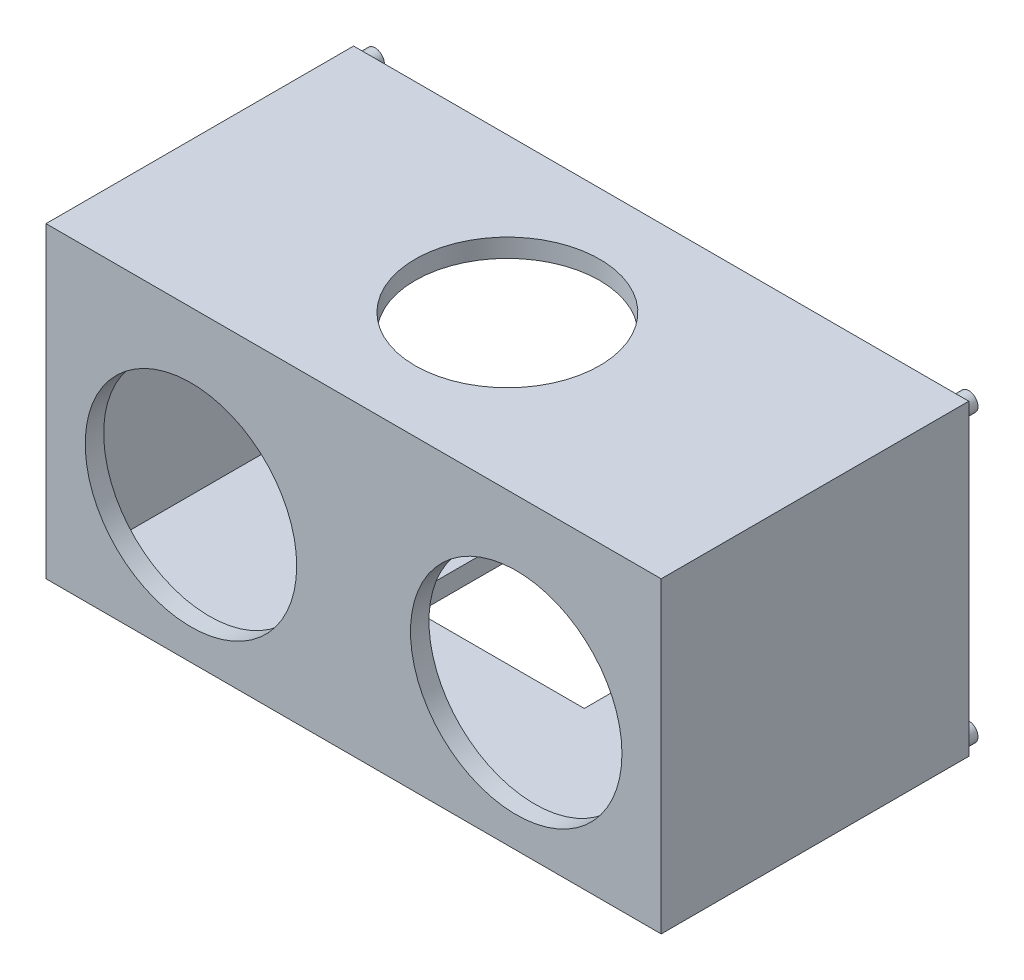
ISO-10303-21;
HEADER;
FILE_DESCRIPTION(('STEP AP214'),'2;1');
FILE_NAME('part.step','',(''),(''),'','','');
FILE_SCHEMA(('AUTOMOTIVE_DESIGN { 1 0 10303 214 1 1 1 1 }'));
ENDSEC;
DATA;
#1=APPLICATION_CONTEXT('core data for automotive mechanical design processes');
#2=APPLICATION_PROTOCOL_DEFINITION('international standard','automotive_design',2000,#1);
#3=PRODUCT_CONTEXT('',#1,'mechanical');
#4=PRODUCT('Part','Part','',(#3));
#5=PRODUCT_RELATED_PRODUCT_CATEGORY('part','',(#4));
#6=PRODUCT_DEFINITION_FORMATION('','',#4);
#7=PRODUCT_DEFINITION_CONTEXT('part definition',#1,'design');
#8=PRODUCT_DEFINITION('design','',#6,#7);
#9=PRODUCT_DEFINITION_SHAPE('','',#8);
#10=(LENGTH_UNIT() NAMED_UNIT(*) SI_UNIT(.MILLI.,.METRE.));
#11=(NAMED_UNIT(*) PLANE_ANGLE_UNIT() SI_UNIT($,.RADIAN.));
#12=(NAMED_UNIT(*) SI_UNIT($,.STERADIAN.) SOLID_ANGLE_UNIT());
#13=UNCERTAINTY_MEASURE_WITH_UNIT(LENGTH_MEASURE(1.E-05),#10,'distance_accuracy_value','');
#14=(GEOMETRIC_REPRESENTATION_CONTEXT(3) GLOBAL_UNCERTAINTY_ASSIGNED_CONTEXT((#13)) GLOBAL_UNIT_ASSIGNED_CONTEXT((#10,
#11,#12)) REPRESENTATION_CONTEXT('',''));
#15=CARTESIAN_POINT('',(0.,0.,0.));
#16=DIRECTION('',(0.,0.,1.));
#17=DIRECTION('',(1.,0.,0.));
#18=AXIS2_PLACEMENT_3D('',#15,#16,#17);
#19=CARTESIAN_POINT('',(-25.4,-12.7,25.4));
#20=DIRECTION('',(0.,1.,0.));
#21=DIRECTION('',(0.,0.,1.));
#22=AXIS2_PLACEMENT_3D('',#19,#20,#21);
#23=PLANE('',#22);
#24=DIRECTION('',(0.,0.,-1.));
#25=VECTOR('',#24,1.);
#26=CARTESIAN_POINT('',(7.62,-12.7,13.97));
#27=LINE('',#26,#25);
#28=CARTESIAN_POINT('',(7.62,-12.7,13.97));
#29=VERTEX_POINT('',#28);
#30=CARTESIAN_POINT('',(7.62,-12.7,0.));
#31=VERTEX_POINT('',#30);
#32=EDGE_CURVE('E156',#29,#31,#27,.T.);
#33=ORIENTED_EDGE('',*,*,#32,.T.);
#34=DIRECTION('',(1.,0.,0.));
#35=VECTOR('',#34,1.);
#36=CARTESIAN_POINT('',(-25.4,-12.7,0.));
#37=LINE('',#36,#35);
#38=CARTESIAN_POINT('',(25.4,-12.7,0.));
#39=VERTEX_POINT('',#38);
#40=EDGE_CURVE('E273',#31,#39,#37,.T.);
#41=ORIENTED_EDGE('',*,*,#40,.T.);
#42=DIRECTION('',(0.,0.,-1.));
#43=VECTOR('',#42,1.);
#44=CARTESIAN_POINT('',(25.4,-12.7,25.4));
#45=LINE('',#44,#43);
#46=CARTESIAN_POINT('',(25.4,-12.7,25.4));
#47=VERTEX_POINT('',#46);
#48=EDGE_CURVE('E289',#47,#39,#45,.T.);
#49=ORIENTED_EDGE('',*,*,#48,.F.);
#50=DIRECTION('',(1.,0.,0.));
#51=VECTOR('',#50,1.);
#52=CARTESIAN_POINT('',(-25.4,-12.7,25.4));
#53=LINE('',#52,#51);
#54=CARTESIAN_POINT('',(-25.4,-12.7,25.4));
#55=VERTEX_POINT('',#54);
#56=EDGE_CURVE('E259',#55,#47,#53,.T.);
#57=ORIENTED_EDGE('',*,*,#56,.F.);
#58=DIRECTION('',(0.,0.,-1.));
#59=VECTOR('',#58,1.);
#60=CARTESIAN_POINT('',(-25.4,-12.7,25.4));
#61=LINE('',#60,#59);
#62=CARTESIAN_POINT('',(-25.4,-12.7,0.));
#63=VERTEX_POINT('',#62);
#64=EDGE_CURVE('E293',#55,#63,#61,.T.);
#65=ORIENTED_EDGE('',*,*,#64,.T.);
#66=CARTESIAN_POINT('',(-7.62,-12.7,0.));
#67=VERTEX_POINT('',#66);
#68=EDGE_CURVE('E274',#63,#67,#37,.T.);
#69=ORIENTED_EDGE('',*,*,#68,.T.);
#70=DIRECTION('',(0.,0.,-1.));
#71=VECTOR('',#70,1.);
#72=CARTESIAN_POINT('',(-7.62,-12.7,13.97));
#73=LINE('',#72,#71);
#74=CARTESIAN_POINT('',(-7.62,-12.7,13.97));
#75=VERTEX_POINT('',#74);
#76=EDGE_CURVE('E162',#75,#67,#73,.T.);
#77=ORIENTED_EDGE('',*,*,#76,.F.);
#78=DIRECTION('',(1.,0.,0.));
#79=VECTOR('',#78,1.);
#80=CARTESIAN_POINT('',(-7.62,-12.7,13.97));
#81=LINE('',#80,#79);
#82=EDGE_CURVE('E149',#75,#29,#81,.T.);
#83=ORIENTED_EDGE('',*,*,#82,.T.);
#84=EDGE_LOOP('',(#33,#41,#49,#57,#65,#69,#77,#83));
#85=FACE_BOUND('',#84,.T.);
#86=ADVANCED_FACE('F45',(#85),#23,.F.);
#87=CARTESIAN_POINT('',(0.,0.,0.));
#88=DIRECTION('',(0.,0.,1.));
#89=DIRECTION('',(1.,0.,0.));
#90=AXIS2_PLACEMENT_3D('',#87,#88,#89);
#91=PLANE('',#90);
#92=CARTESIAN_POINT('',(24.511,11.811,0.));
#93=DIRECTION('',(0.,0.,1.));
#94=DIRECTION('',(1.,0.,0.));
#95=AXIS2_PLACEMENT_3D('',#92,#93,#94);
#96=CIRCLE('',#95,0.761999999999999);
#97=CARTESIAN_POINT('',(25.273,11.811,0.));
#98=VERTEX_POINT('',#97);
#99=EDGE_CURVE('E297',#98,#98,#96,.F.);
#100=ORIENTED_EDGE('',*,*,#99,.F.);
#101=EDGE_LOOP('',(#100));
#102=FACE_BOUND('',#101,.T.);
#103=CARTESIAN_POINT('',(-24.511,11.811,0.));
#104=DIRECTION('',(0.,0.,1.));
#105=DIRECTION('',(1.,0.,0.));
#106=AXIS2_PLACEMENT_3D('',#103,#104,#105);
#107=CIRCLE('',#106,0.761999999999999);
#108=CARTESIAN_POINT('',(-23.749,11.811,0.));
#109=VERTEX_POINT('',#108);
#110=EDGE_CURVE('E301',#109,#109,#107,.F.);
#111=ORIENTED_EDGE('',*,*,#110,.F.);
#112=EDGE_LOOP('',(#111));
#113=FACE_BOUND('',#112,.T.);
#114=CARTESIAN_POINT('',(-24.511,-11.811,0.));
#115=DIRECTION('',(0.,0.,1.));
#116=DIRECTION('',(1.,0.,0.));
#117=AXIS2_PLACEMENT_3D('',#114,#115,#116);
#118=CIRCLE('',#117,0.761999999999999);
#119=CARTESIAN_POINT('',(-23.749,-11.811,0.));
#120=VERTEX_POINT('',#119);
#121=EDGE_CURVE('E55',#120,#120,#118,.F.);
#122=ORIENTED_EDGE('',*,*,#121,.F.);
#123=EDGE_LOOP('',(#122));
#124=FACE_BOUND('',#123,.T.);
#125=CARTESIAN_POINT('',(24.511,-11.811,0.));
#126=DIRECTION('',(0.,0.,1.));
#127=DIRECTION('',(1.,0.,0.));
#128=AXIS2_PLACEMENT_3D('',#125,#126,#127);
#129=CIRCLE('',#128,0.761999999999999);
#130=CARTESIAN_POINT('',(25.273,-11.811,0.));
#131=VERTEX_POINT('',#130);
#132=EDGE_CURVE('E11',#131,#131,#129,.F.);
#133=ORIENTED_EDGE('',*,*,#132,.F.);
#134=EDGE_LOOP('',(#133));
#135=FACE_BOUND('',#134,.T.);
#136=DIRECTION('',(0.,-1.,0.));
#137=VECTOR('',#136,1.);
#138=CARTESIAN_POINT('',(7.62,31.8501021570466,0.));
#139=LINE('',#138,#137);
#140=CARTESIAN_POINT('',(7.62,-11.176,0.));
#141=VERTEX_POINT('',#140);
#142=EDGE_CURVE('E153',#141,#31,#139,.T.);
#143=ORIENTED_EDGE('',*,*,#142,.F.);
#144=DIRECTION('',(1.,0.,0.));
#145=VECTOR('',#144,1.);
#146=CARTESIAN_POINT('',(-25.4,-11.176,0.));
#147=LINE('',#146,#145);
#148=CARTESIAN_POINT('',(23.876,-11.176,0.));
#149=VERTEX_POINT('',#148);
#150=EDGE_CURVE('E244',#141,#149,#147,.T.);
#151=ORIENTED_EDGE('',*,*,#150,.T.);
#152=DIRECTION('',(0.,1.,0.));
#153=VECTOR('',#152,1.);
#154=CARTESIAN_POINT('',(23.876,12.7,0.));
#155=LINE('',#154,#153);
#156=CARTESIAN_POINT('',(23.876,11.176,0.));
#157=VERTEX_POINT('',#156);
#158=EDGE_CURVE('E247',#149,#157,#155,.T.);
#159=ORIENTED_EDGE('',*,*,#158,.T.);
#160=DIRECTION('',(-1.,0.,0.));
#161=VECTOR('',#160,1.);
#162=CARTESIAN_POINT('',(-25.4,11.176,0.));
#163=LINE('',#162,#161);
#164=CARTESIAN_POINT('',(-23.876,11.176,0.));
#165=VERTEX_POINT('',#164);
#166=EDGE_CURVE('E222',#157,#165,#163,.T.);
#167=ORIENTED_EDGE('',*,*,#166,.T.);
#168=DIRECTION('',(0.,-1.,0.));
#169=VECTOR('',#168,1.);
#170=CARTESIAN_POINT('',(-23.876,12.7,0.));
#171=LINE('',#170,#169);
#172=CARTESIAN_POINT('',(-23.876,-11.176,0.));
#173=VERTEX_POINT('',#172);
#174=EDGE_CURVE('E210',#165,#173,#171,.T.);
#175=ORIENTED_EDGE('',*,*,#174,.T.);
#176=CARTESIAN_POINT('',(-7.62,-11.176,0.));
#177=VERTEX_POINT('',#176);
#178=EDGE_CURVE('E251',#173,#177,#147,.T.);
#179=ORIENTED_EDGE('',*,*,#178,.T.);
#180=DIRECTION('',(0.,-1.,0.));
#181=VECTOR('',#180,1.);
#182=CARTESIAN_POINT('',(-7.62,31.8501021570466,0.));
#183=LINE('',#182,#181);
#184=EDGE_CURVE('E180',#177,#67,#183,.T.);
#185=ORIENTED_EDGE('',*,*,#184,.T.);
#186=ORIENTED_EDGE('',*,*,#68,.F.);
#187=DIRECTION('',(0.,-1.,0.));
#188=VECTOR('',#187,1.);
#189=CARTESIAN_POINT('',(-25.4,12.7,0.));
#190=LINE('',#189,#188);
#191=CARTESIAN_POINT('',(-25.4,12.7,0.));
#192=VERTEX_POINT('',#191);
#193=EDGE_CURVE('E215',#192,#63,#190,.T.);
#194=ORIENTED_EDGE('',*,*,#193,.F.);
#195=DIRECTION('',(-1.,0.,0.));
#196=VECTOR('',#195,1.);
#197=CARTESIAN_POINT('',(-25.4,12.7,0.));
#198=LINE('',#197,#196);
#199=CARTESIAN_POINT('',(25.4,12.7,0.));
#200=VERTEX_POINT('',#199);
#201=EDGE_CURVE('E260',#200,#192,#198,.T.);
#202=ORIENTED_EDGE('',*,*,#201,.F.);
#203=DIRECTION('',(0.,1.,0.));
#204=VECTOR('',#203,1.);
#205=CARTESIAN_POINT('',(25.4,12.7,0.));
#206=LINE('',#205,#204);
#207=EDGE_CURVE('E277',#39,#200,#206,.T.);
#208=ORIENTED_EDGE('',*,*,#207,.F.);
#209=ORIENTED_EDGE('',*,*,#40,.F.);
#210=EDGE_LOOP('',(#143,#151,#159,#167,#175,#179,#185,#186,#194,#202,#208,#209));
#211=FACE_BOUND('',#210,.T.);
#212=ADVANCED_FACE('F347',(#102,#113,#124,#135,#211),#91,.F.);
#213=CARTESIAN_POINT('',(-25.4,-11.176,25.4));
#214=DIRECTION('',(0.,1.,0.));
#215=DIRECTION('',(0.,0.,1.));
#216=AXIS2_PLACEMENT_3D('',#213,#214,#215);
#217=PLANE('',#216);
#218=DIRECTION('',(-1.,0.,0.));
#219=VECTOR('',#218,1.);
#220=CARTESIAN_POINT('',(-25.4,-11.176,13.97));
#221=LINE('',#220,#219);
#222=CARTESIAN_POINT('',(7.62,-11.176,13.97));
#223=VERTEX_POINT('',#222);
#224=CARTESIAN_POINT('',(-7.62,-11.176,13.97));
#225=VERTEX_POINT('',#224);
#226=EDGE_CURVE('E151',#223,#225,#221,.T.);
#227=ORIENTED_EDGE('',*,*,#226,.T.);
#228=DIRECTION('',(0.,0.,1.));
#229=VECTOR('',#228,1.);
#230=CARTESIAN_POINT('',(-7.62,-11.176,25.4));
#231=LINE('',#230,#229);
#232=CARTESIAN_POINT('',(-7.62,-11.176,12.7));
#233=VERTEX_POINT('',#232);
#234=EDGE_CURVE('E71',#233,#225,#231,.T.);
#235=ORIENTED_EDGE('',*,*,#234,.F.);
#236=EDGE_CURVE('E186',#177,#233,#231,.T.);
#237=ORIENTED_EDGE('',*,*,#236,.F.);
#238=ORIENTED_EDGE('',*,*,#178,.F.);
#239=DIRECTION('',(0.,0.,-1.));
#240=VECTOR('',#239,1.);
#241=CARTESIAN_POINT('',(-23.876,-11.176,25.4));
#242=LINE('',#241,#240);
#243=CARTESIAN_POINT('',(-23.876,-11.176,23.876));
#244=VERTEX_POINT('',#243);
#245=EDGE_CURVE('E211',#244,#173,#242,.T.);
#246=ORIENTED_EDGE('',*,*,#245,.F.);
#247=DIRECTION('',(1.,0.,0.));
#248=VECTOR('',#247,1.);
#249=CARTESIAN_POINT('',(-25.4,-11.176,23.876));
#250=LINE('',#249,#248);
#251=CARTESIAN_POINT('',(23.876,-11.176,23.876));
#252=VERTEX_POINT('',#251);
#253=EDGE_CURVE('E221',#244,#252,#250,.T.);
#254=ORIENTED_EDGE('',*,*,#253,.T.);
#255=DIRECTION('',(0.,0.,-1.));
#256=VECTOR('',#255,1.);
#257=CARTESIAN_POINT('',(23.876,-11.176,25.4));
#258=LINE('',#257,#256);
#259=EDGE_CURVE('E216',#252,#149,#258,.T.);
#260=ORIENTED_EDGE('',*,*,#259,.T.);
#261=ORIENTED_EDGE('',*,*,#150,.F.);
#262=DIRECTION('',(0.,0.,1.));
#263=VECTOR('',#262,1.);
#264=CARTESIAN_POINT('',(7.62,-11.176,25.4));
#265=LINE('',#264,#263);
#266=CARTESIAN_POINT('',(7.62,-11.176,12.7));
#267=VERTEX_POINT('',#266);
#268=EDGE_CURVE('E189',#141,#267,#265,.T.);
#269=ORIENTED_EDGE('',*,*,#268,.T.);
#270=EDGE_CURVE('E63',#267,#223,#265,.T.);
#271=ORIENTED_EDGE('',*,*,#270,.T.);
#272=EDGE_LOOP('',(#227,#235,#237,#238,#246,#254,#260,#261,#269,#271));
#273=FACE_BOUND('',#272,.T.);
#274=ADVANCED_FACE('F359',(#273),#217,.T.);
#275=CARTESIAN_POINT('',(-25.4,12.7,25.4));
#276=DIRECTION('',(1.,0.,0.));
#277=DIRECTION('',(0.,1.,0.));
#278=AXIS2_PLACEMENT_3D('',#275,#276,#277);
#279=PLANE('',#278);
#280=ORIENTED_EDGE('',*,*,#193,.T.);
#281=ORIENTED_EDGE('',*,*,#64,.F.);
#282=DIRECTION('',(0.,-1.,0.));
#283=VECTOR('',#282,1.);
#284=CARTESIAN_POINT('',(-25.4,12.7,25.4));
#285=LINE('',#284,#283);
#286=CARTESIAN_POINT('',(-25.4,12.7,25.4));
#287=VERTEX_POINT('',#286);
#288=EDGE_CURVE('E255',#287,#55,#285,.T.);
#289=ORIENTED_EDGE('',*,*,#288,.F.);
#290=DIRECTION('',(0.,0.,-1.));
#291=VECTOR('',#290,1.);
#292=CARTESIAN_POINT('',(-25.4,12.7,25.4));
#293=LINE('',#292,#291);
#294=EDGE_CURVE('E269',#287,#192,#293,.T.);
#295=ORIENTED_EDGE('',*,*,#294,.T.);
#296=EDGE_LOOP('',(#280,#281,#289,#295));
#297=FACE_BOUND('',#296,.T.);
#298=ADVANCED_FACE('F47',(#297),#279,.F.);
#299=CARTESIAN_POINT('',(25.4,12.7,25.4));
#300=DIRECTION('',(-1.,0.,0.));
#301=DIRECTION('',(0.,-1.,0.));
#302=AXIS2_PLACEMENT_3D('',#299,#300,#301);
#303=PLANE('',#302);
#304=ORIENTED_EDGE('',*,*,#207,.T.);
#305=DIRECTION('',(0.,0.,-1.));
#306=VECTOR('',#305,1.);
#307=CARTESIAN_POINT('',(25.4,12.7,25.4));
#308=LINE('',#307,#306);
#309=CARTESIAN_POINT('',(25.4,12.7,25.4));
#310=VERTEX_POINT('',#309);
#311=EDGE_CURVE('E285',#310,#200,#308,.T.);
#312=ORIENTED_EDGE('',*,*,#311,.F.);
#313=DIRECTION('',(0.,1.,0.));
#314=VECTOR('',#313,1.);
#315=CARTESIAN_POINT('',(25.4,12.7,25.4));
#316=LINE('',#315,#314);
#317=EDGE_CURVE('E263',#47,#310,#316,.T.);
#318=ORIENTED_EDGE('',*,*,#317,.F.);
#319=ORIENTED_EDGE('',*,*,#48,.T.);
#320=EDGE_LOOP('',(#304,#312,#318,#319));
#321=FACE_BOUND('',#320,.T.);
#322=ADVANCED_FACE('F335',(#321),#303,.F.);
#323=CARTESIAN_POINT('',(-25.4,12.7,25.4));
#324=DIRECTION('',(0.,-1.,0.));
#325=DIRECTION('',(0.,0.,-1.));
#326=AXIS2_PLACEMENT_3D('',#323,#324,#325);
#327=PLANE('',#326);
#328=CARTESIAN_POINT('',(0.,12.7,12.7));
#329=DIRECTION('',(0.,1.,0.));
#330=DIRECTION('',(0.,0.,1.));
#331=AXIS2_PLACEMENT_3D('',#328,#329,#330);
#332=CIRCLE('',#331,7.62);
#333=CARTESIAN_POINT('',(0.,12.7,20.32));
#334=VERTEX_POINT('',#333);
#335=EDGE_CURVE('E170',#334,#334,#332,.T.);
#336=ORIENTED_EDGE('',*,*,#335,.F.);
#337=EDGE_LOOP('',(#336));
#338=FACE_BOUND('',#337,.T.);
#339=ORIENTED_EDGE('',*,*,#201,.T.);
#340=ORIENTED_EDGE('',*,*,#294,.F.);
#341=DIRECTION('',(-1.,0.,0.));
#342=VECTOR('',#341,1.);
#343=CARTESIAN_POINT('',(-25.4,12.7,25.4));
#344=LINE('',#343,#342);
#345=EDGE_CURVE('E266',#310,#287,#344,.T.);
#346=ORIENTED_EDGE('',*,*,#345,.F.);
#347=ORIENTED_EDGE('',*,*,#311,.T.);
#348=EDGE_LOOP('',(#339,#340,#346,#347));
#349=FACE_BOUND('',#348,.T.);
#350=ADVANCED_FACE('F331',(#338,#349),#327,.F.);
#351=CARTESIAN_POINT('',(0.,0.,25.4));
#352=DIRECTION('',(0.,0.,1.));
#353=DIRECTION('',(1.,0.,0.));
#354=AXIS2_PLACEMENT_3D('',#351,#352,#353);
#355=PLANE('',#354);
#356=CARTESIAN_POINT('',(-13.43025,-1.42875,25.4));
#357=DIRECTION('',(0.,0.,1.));
#358=DIRECTION('',(1.,0.,0.));
#359=AXIS2_PLACEMENT_3D('',#356,#357,#358);
#360=CIRCLE('',#359,8.73125);
#361=CARTESIAN_POINT('',(-4.699,-1.42875,25.4));
#362=VERTEX_POINT('',#361);
#363=EDGE_CURVE('E320',#362,#362,#360,.T.);
#364=ORIENTED_EDGE('',*,*,#363,.F.);
#365=EDGE_LOOP('',(#364));
#366=FACE_BOUND('',#365,.T.);
#367=CARTESIAN_POINT('',(13.43025,-1.42875,25.4));
#368=DIRECTION('',(0.,0.,1.));
#369=DIRECTION('',(1.,0.,0.));
#370=AXIS2_PLACEMENT_3D('',#367,#368,#369);
#371=CIRCLE('',#370,8.73124999999999);
#372=CARTESIAN_POINT('',(22.1615,-1.42875,25.4));
#373=VERTEX_POINT('',#372);
#374=EDGE_CURVE('E310',#373,#373,#371,.T.);
#375=ORIENTED_EDGE('',*,*,#374,.F.);
#376=EDGE_LOOP('',(#375));
#377=FACE_BOUND('',#376,.T.);
#378=ORIENTED_EDGE('',*,*,#288,.T.);
#379=ORIENTED_EDGE('',*,*,#56,.T.);
#380=ORIENTED_EDGE('',*,*,#317,.T.);
#381=ORIENTED_EDGE('',*,*,#345,.T.);
#382=EDGE_LOOP('',(#378,#379,#380,#381));
#383=FACE_BOUND('',#382,.T.);
#384=ADVANCED_FACE('F334',(#366,#377,#383),#355,.T.);
#385=CARTESIAN_POINT('',(-23.876,12.7,25.4));
#386=DIRECTION('',(1.,0.,0.));
#387=DIRECTION('',(0.,1.,0.));
#388=AXIS2_PLACEMENT_3D('',#385,#386,#387);
#389=PLANE('',#388);
#390=ORIENTED_EDGE('',*,*,#174,.F.);
#391=DIRECTION('',(0.,0.,-1.));
#392=VECTOR('',#391,1.);
#393=CARTESIAN_POINT('',(-23.876,11.176,25.4));
#394=LINE('',#393,#392);
#395=CARTESIAN_POINT('',(-23.876,11.176,23.876));
#396=VERTEX_POINT('',#395);
#397=EDGE_CURVE('E223',#396,#165,#394,.T.);
#398=ORIENTED_EDGE('',*,*,#397,.F.);
#399=DIRECTION('',(0.,-1.,0.));
#400=VECTOR('',#399,1.);
#401=CARTESIAN_POINT('',(-23.876,12.7,23.876));
#402=LINE('',#401,#400);
#403=EDGE_CURVE('E217',#396,#244,#402,.T.);
#404=ORIENTED_EDGE('',*,*,#403,.T.);
#405=ORIENTED_EDGE('',*,*,#245,.T.);
#406=EDGE_LOOP('',(#390,#398,#404,#405));
#407=FACE_BOUND('',#406,.T.);
#408=ADVANCED_FACE('F365',(#407),#389,.T.);
#409=CARTESIAN_POINT('',(23.876,12.7,25.4));
#410=DIRECTION('',(-1.,0.,0.));
#411=DIRECTION('',(0.,-1.,0.));
#412=AXIS2_PLACEMENT_3D('',#409,#410,#411);
#413=PLANE('',#412);
#414=ORIENTED_EDGE('',*,*,#158,.F.);
#415=ORIENTED_EDGE('',*,*,#259,.F.);
#416=DIRECTION('',(0.,1.,0.));
#417=VECTOR('',#416,1.);
#418=CARTESIAN_POINT('',(23.876,12.7,23.876));
#419=LINE('',#418,#417);
#420=CARTESIAN_POINT('',(23.876,11.176,23.876));
#421=VERTEX_POINT('',#420);
#422=EDGE_CURVE('E234',#252,#421,#419,.T.);
#423=ORIENTED_EDGE('',*,*,#422,.T.);
#424=DIRECTION('',(0.,0.,-1.));
#425=VECTOR('',#424,1.);
#426=CARTESIAN_POINT('',(23.876,11.176,25.4));
#427=LINE('',#426,#425);
#428=EDGE_CURVE('E227',#421,#157,#427,.T.);
#429=ORIENTED_EDGE('',*,*,#428,.T.);
#430=EDGE_LOOP('',(#414,#415,#423,#429));
#431=FACE_BOUND('',#430,.T.);
#432=ADVANCED_FACE('F372',(#431),#413,.T.);
#433=CARTESIAN_POINT('',(-25.4,11.176,25.4));
#434=DIRECTION('',(0.,-1.,0.));
#435=DIRECTION('',(0.,0.,-1.));
#436=AXIS2_PLACEMENT_3D('',#433,#434,#435);
#437=PLANE('',#436);
#438=CARTESIAN_POINT('',(0.,11.176,12.7));
#439=DIRECTION('',(0.,-1.,0.));
#440=DIRECTION('',(0.,0.,-1.));
#441=AXIS2_PLACEMENT_3D('',#438,#439,#440);
#442=CIRCLE('',#441,7.62);
#443=CARTESIAN_POINT('',(0.,11.176,5.08));
#444=VERTEX_POINT('',#443);
#445=EDGE_CURVE('E166',#444,#444,#442,.T.);
#446=ORIENTED_EDGE('',*,*,#445,.F.);
#447=EDGE_LOOP('',(#446));
#448=FACE_BOUND('',#447,.T.);
#449=ORIENTED_EDGE('',*,*,#397,.T.);
#450=ORIENTED_EDGE('',*,*,#166,.F.);
#451=ORIENTED_EDGE('',*,*,#428,.F.);
#452=DIRECTION('',(-1.,0.,0.));
#453=VECTOR('',#452,1.);
#454=CARTESIAN_POINT('',(-25.4,11.176,23.876));
#455=LINE('',#454,#453);
#456=EDGE_CURVE('E228',#421,#396,#455,.T.);
#457=ORIENTED_EDGE('',*,*,#456,.T.);
#458=EDGE_LOOP('',(#449,#450,#451,#457));
#459=FACE_BOUND('',#458,.T.);
#460=ADVANCED_FACE('F377',(#448,#459),#437,.T.);
#461=CARTESIAN_POINT('',(0.,0.,23.876));
#462=DIRECTION('',(0.,0.,1.));
#463=DIRECTION('',(1.,0.,0.));
#464=AXIS2_PLACEMENT_3D('',#461,#462,#463);
#465=PLANE('',#464);
#466=CARTESIAN_POINT('',(-13.43025,-1.42875,23.876));
#467=DIRECTION('',(0.,0.,1.));
#468=DIRECTION('',(1.,0.,0.));
#469=AXIS2_PLACEMENT_3D('',#466,#467,#468);
#470=CIRCLE('',#469,8.73125);
#471=CARTESIAN_POINT('',(-4.699,-1.42875,23.876));
#472=VERTEX_POINT('',#471);
#473=EDGE_CURVE('E49',#472,#472,#470,.T.);
#474=ORIENTED_EDGE('',*,*,#473,.T.);
#475=EDGE_LOOP('',(#474));
#476=FACE_BOUND('',#475,.T.);
#477=CARTESIAN_POINT('',(13.43025,-1.42875,23.876));
#478=DIRECTION('',(0.,0.,1.));
#479=DIRECTION('',(1.,0.,0.));
#480=AXIS2_PLACEMENT_3D('',#477,#478,#479);
#481=CIRCLE('',#480,8.73124999999999);
#482=CARTESIAN_POINT('',(22.1615,-1.42875,23.876));
#483=VERTEX_POINT('',#482);
#484=EDGE_CURVE('E307',#483,#483,#481,.T.);
#485=ORIENTED_EDGE('',*,*,#484,.T.);
#486=EDGE_LOOP('',(#485));
#487=FACE_BOUND('',#486,.T.);
#488=ORIENTED_EDGE('',*,*,#403,.F.);
#489=ORIENTED_EDGE('',*,*,#456,.F.);
#490=ORIENTED_EDGE('',*,*,#422,.F.);
#491=ORIENTED_EDGE('',*,*,#253,.F.);
#492=EDGE_LOOP('',(#488,#489,#490,#491));
#493=FACE_BOUND('',#492,.T.);
#494=ADVANCED_FACE('F375',(#476,#487,#493),#465,.F.);
#495=CARTESIAN_POINT('',(24.511,11.811,-0.889));
#496=DIRECTION('',(0.,0.,1.));
#497=DIRECTION('',(1.,0.,0.));
#498=AXIS2_PLACEMENT_3D('',#495,#496,#497);
#499=CYLINDRICAL_SURFACE('',#498,0.761999999999999);
#500=CARTESIAN_POINT('',(24.511,11.811,-0.889));
#501=DIRECTION('',(0.,0.,-1.));
#502=DIRECTION('',(-1.,0.,0.));
#503=AXIS2_PLACEMENT_3D('',#500,#501,#502);
#504=CIRCLE('',#503,0.761999999999999);
#505=CARTESIAN_POINT('',(23.749,11.811,-0.889));
#506=VERTEX_POINT('',#505);
#507=EDGE_CURVE('E206',#506,#506,#504,.T.);
#508=ORIENTED_EDGE('',*,*,#507,.F.);
#509=EDGE_LOOP('',(#508));
#510=FACE_BOUND('',#509,.T.);
#511=ORIENTED_EDGE('',*,*,#99,.T.);
#512=EDGE_LOOP('',(#511));
#513=FACE_BOUND('',#512,.T.);
#514=ADVANCED_FACE('F385',(#510,#513),#499,.T.);
#515=CARTESIAN_POINT('',(24.511,11.811,-0.889));
#516=DIRECTION('',(0.,0.,-1.));
#517=DIRECTION('',(-1.,0.,0.));
#518=AXIS2_PLACEMENT_3D('',#515,#516,#517);
#519=PLANE('',#518);
#520=ORIENTED_EDGE('',*,*,#507,.T.);
#521=EDGE_LOOP('',(#520));
#522=FACE_BOUND('',#521,.T.);
#523=ADVANCED_FACE('F466',(#522),#519,.T.);
#524=CARTESIAN_POINT('',(-24.511,11.811,-0.889));
#525=DIRECTION('',(0.,0.,1.));
#526=DIRECTION('',(1.,0.,0.));
#527=AXIS2_PLACEMENT_3D('',#524,#525,#526);
#528=CYLINDRICAL_SURFACE('',#527,0.761999999999999);
#529=CARTESIAN_POINT('',(-24.511,11.811,-0.889));
#530=DIRECTION('',(0.,0.,-1.));
#531=DIRECTION('',(1.,0.,0.));
#532=AXIS2_PLACEMENT_3D('',#529,#530,#531);
#533=CIRCLE('',#532,0.761999999999999);
#534=CARTESIAN_POINT('',(-23.749,11.811,-0.889));
#535=VERTEX_POINT('',#534);
#536=EDGE_CURVE('E202',#535,#535,#533,.T.);
#537=ORIENTED_EDGE('',*,*,#536,.F.);
#538=EDGE_LOOP('',(#537));
#539=FACE_BOUND('',#538,.T.);
#540=ORIENTED_EDGE('',*,*,#110,.T.);
#541=EDGE_LOOP('',(#540));
#542=FACE_BOUND('',#541,.T.);
#543=ADVANCED_FACE('F475',(#539,#542),#528,.T.);
#544=CARTESIAN_POINT('',(-24.511,11.811,-0.889));
#545=DIRECTION('',(0.,0.,1.));
#546=DIRECTION('',(1.,0.,0.));
#547=AXIS2_PLACEMENT_3D('',#544,#545,#546);
#548=PLANE('',#547);
#549=ORIENTED_EDGE('',*,*,#536,.T.);
#550=EDGE_LOOP('',(#549));
#551=FACE_BOUND('',#550,.T.);
#552=ADVANCED_FACE('F484',(#551),#548,.F.);
#553=CARTESIAN_POINT('',(-24.511,-11.811,-0.889));
#554=DIRECTION('',(0.,0.,1.));
#555=DIRECTION('',(1.,0.,0.));
#556=AXIS2_PLACEMENT_3D('',#553,#554,#555);
#557=CYLINDRICAL_SURFACE('',#556,0.761999999999999);
#558=CARTESIAN_POINT('',(-24.511,-11.811,-0.889));
#559=DIRECTION('',(0.,0.,-1.));
#560=DIRECTION('',(-1.,0.,0.));
#561=AXIS2_PLACEMENT_3D('',#558,#559,#560);
#562=CIRCLE('',#561,0.761999999999999);
#563=CARTESIAN_POINT('',(-25.273,-11.811,-0.889));
#564=VERTEX_POINT('',#563);
#565=EDGE_CURVE('E198',#564,#564,#562,.T.);
#566=ORIENTED_EDGE('',*,*,#565,.F.);
#567=EDGE_LOOP('',(#566));
#568=FACE_BOUND('',#567,.T.);
#569=ORIENTED_EDGE('',*,*,#121,.T.);
#570=EDGE_LOOP('',(#569));
#571=FACE_BOUND('',#570,.T.);
#572=ADVANCED_FACE('F494',(#568,#571),#557,.T.);
#573=CARTESIAN_POINT('',(-24.511,-11.811,-0.889));
#574=DIRECTION('',(0.,0.,-1.));
#575=DIRECTION('',(-1.,0.,0.));
#576=AXIS2_PLACEMENT_3D('',#573,#574,#575);
#577=PLANE('',#576);
#578=ORIENTED_EDGE('',*,*,#565,.T.);
#579=EDGE_LOOP('',(#578));
#580=FACE_BOUND('',#579,.T.);
#581=ADVANCED_FACE('F504',(#580),#577,.T.);
#582=CARTESIAN_POINT('',(24.511,-11.811,-0.889));
#583=DIRECTION('',(0.,0.,1.));
#584=DIRECTION('',(1.,0.,0.));
#585=AXIS2_PLACEMENT_3D('',#582,#583,#584);
#586=CYLINDRICAL_SURFACE('',#585,0.761999999999999);
#587=CARTESIAN_POINT('',(24.511,-11.811,-0.889));
#588=DIRECTION('',(0.,0.,-1.));
#589=DIRECTION('',(1.,0.,0.));
#590=AXIS2_PLACEMENT_3D('',#587,#588,#589);
#591=CIRCLE('',#590,0.761999999999999);
#592=CARTESIAN_POINT('',(25.273,-11.811,-0.889));
#593=VERTEX_POINT('',#592);
#594=EDGE_CURVE('E194',#593,#593,#591,.T.);
#595=ORIENTED_EDGE('',*,*,#594,.F.);
#596=EDGE_LOOP('',(#595));
#597=FACE_BOUND('',#596,.T.);
#598=ORIENTED_EDGE('',*,*,#132,.T.);
#599=EDGE_LOOP('',(#598));
#600=FACE_BOUND('',#599,.T.);
#601=ADVANCED_FACE('F514',(#597,#600),#586,.T.);
#602=CARTESIAN_POINT('',(24.511,-11.811,-0.889));
#603=DIRECTION('',(0.,0.,1.));
#604=DIRECTION('',(1.,0.,0.));
#605=AXIS2_PLACEMENT_3D('',#602,#603,#604);
#606=PLANE('',#605);
#607=ORIENTED_EDGE('',*,*,#594,.T.);
#608=EDGE_LOOP('',(#607));
#609=FACE_BOUND('',#608,.T.);
#610=ADVANCED_FACE('F524',(#609),#606,.F.);
#611=CARTESIAN_POINT('',(-7.62,31.8501021570466,13.97));
#612=DIRECTION('',(0.,0.,-1.));
#613=DIRECTION('',(-1.,0.,0.));
#614=AXIS2_PLACEMENT_3D('',#611,#612,#613);
#615=PLANE('',#614);
#616=DIRECTION('',(0.,-1.,0.));
#617=VECTOR('',#616,1.);
#618=CARTESIAN_POINT('',(7.62,31.8501021570466,13.97));
#619=LINE('',#618,#617);
#620=EDGE_CURVE('E144',#223,#29,#619,.T.);
#621=ORIENTED_EDGE('',*,*,#620,.T.);
#622=ORIENTED_EDGE('',*,*,#82,.F.);
#623=DIRECTION('',(0.,-1.,0.));
#624=VECTOR('',#623,1.);
#625=CARTESIAN_POINT('',(-7.62,31.8501021570466,13.97));
#626=LINE('',#625,#624);
#627=EDGE_CURVE('E177',#225,#75,#626,.T.);
#628=ORIENTED_EDGE('',*,*,#627,.F.);
#629=ORIENTED_EDGE('',*,*,#226,.F.);
#630=EDGE_LOOP('',(#621,#622,#628,#629));
#631=FACE_BOUND('',#630,.T.);
#632=ADVANCED_FACE('F146',(#631),#615,.T.);
#633=CARTESIAN_POINT('',(7.62,31.8501021570466,13.97));
#634=DIRECTION('',(-1.,0.,0.));
#635=DIRECTION('',(0.,0.,1.));
#636=AXIS2_PLACEMENT_3D('',#633,#634,#635);
#637=PLANE('',#636);
#638=ORIENTED_EDGE('',*,*,#142,.T.);
#639=ORIENTED_EDGE('',*,*,#32,.F.);
#640=ORIENTED_EDGE('',*,*,#620,.F.);
#641=ORIENTED_EDGE('',*,*,#270,.F.);
#642=ORIENTED_EDGE('',*,*,#268,.F.);
#643=EDGE_LOOP('',(#638,#639,#640,#641,#642));
#644=FACE_BOUND('',#643,.T.);
#645=ADVANCED_FACE('F157',(#644),#637,.T.);
#646=CARTESIAN_POINT('',(-7.62,31.8501021570466,13.97));
#647=DIRECTION('',(-1.,0.,0.));
#648=DIRECTION('',(0.,0.,1.));
#649=AXIS2_PLACEMENT_3D('',#646,#647,#648);
#650=PLANE('',#649);
#651=ORIENTED_EDGE('',*,*,#236,.T.);
#652=ORIENTED_EDGE('',*,*,#234,.T.);
#653=ORIENTED_EDGE('',*,*,#627,.T.);
#654=ORIENTED_EDGE('',*,*,#76,.T.);
#655=ORIENTED_EDGE('',*,*,#184,.F.);
#656=EDGE_LOOP('',(#651,#652,#653,#654,#655));
#657=FACE_BOUND('',#656,.T.);
#658=ADVANCED_FACE('F358',(#657),#650,.F.);
#659=CARTESIAN_POINT('',(0.,-32.728614690566,12.7));
#660=DIRECTION('',(0.,1.,0.));
#661=DIRECTION('',(0.,0.,1.));
#662=AXIS2_PLACEMENT_3D('',#659,#660,#661);
#663=CYLINDRICAL_SURFACE('',#662,7.62);
#664=ORIENTED_EDGE('',*,*,#445,.T.);
#665=EDGE_LOOP('',(#664));
#666=FACE_BOUND('',#665,.T.);
#667=ORIENTED_EDGE('',*,*,#335,.T.);
#668=EDGE_LOOP('',(#667));
#669=FACE_BOUND('',#668,.T.);
#670=ADVANCED_FACE('F329',(#666,#669),#663,.F.);
#671=CARTESIAN_POINT('',(13.43025,-1.42875,-0.889000000000001));
#672=DIRECTION('',(0.,0.,1.));
#673=DIRECTION('',(1.,0.,0.));
#674=AXIS2_PLACEMENT_3D('',#671,#672,#673);
#675=CYLINDRICAL_SURFACE('',#674,8.73124999999999);
#676=ORIENTED_EDGE('',*,*,#374,.T.);
#677=EDGE_LOOP('',(#676));
#678=FACE_BOUND('',#677,.T.);
#679=ORIENTED_EDGE('',*,*,#484,.F.);
#680=EDGE_LOOP('',(#679));
#681=FACE_BOUND('',#680,.T.);
#682=ADVANCED_FACE('F577',(#678,#681),#675,.F.);
#683=CARTESIAN_POINT('',(-13.43025,-1.42875,-0.889000000000001));
#684=DIRECTION('',(0.,0.,1.));
#685=DIRECTION('',(1.,0.,0.));
#686=AXIS2_PLACEMENT_3D('',#683,#684,#685);
#687=CYLINDRICAL_SURFACE('',#686,8.73125);
#688=ORIENTED_EDGE('',*,*,#363,.T.);
#689=EDGE_LOOP('',(#688));
#690=FACE_BOUND('',#689,.T.);
#691=ORIENTED_EDGE('',*,*,#473,.F.);
#692=EDGE_LOOP('',(#691));
#693=FACE_BOUND('',#692,.T.);
#694=ADVANCED_FACE('F586',(#690,#693),#687,.F.);
#695=CLOSED_SHELL('',(#86,#212,#274,#298,#322,#350,#384,#408,#432,#460,#494,#514,#523,#543,#552,
#572,#581,#601,#610,#632,#645,#658,#670,#682,#694));
#696=MANIFOLD_SOLID_BREP('B2',#695);
#697=ADVANCED_BREP_SHAPE_REPRESENTATION('',(#18,#696),#14);
#698=SHAPE_DEFINITION_REPRESENTATION(#9,#697);
ENDSEC;
END-ISO-10303-21;
